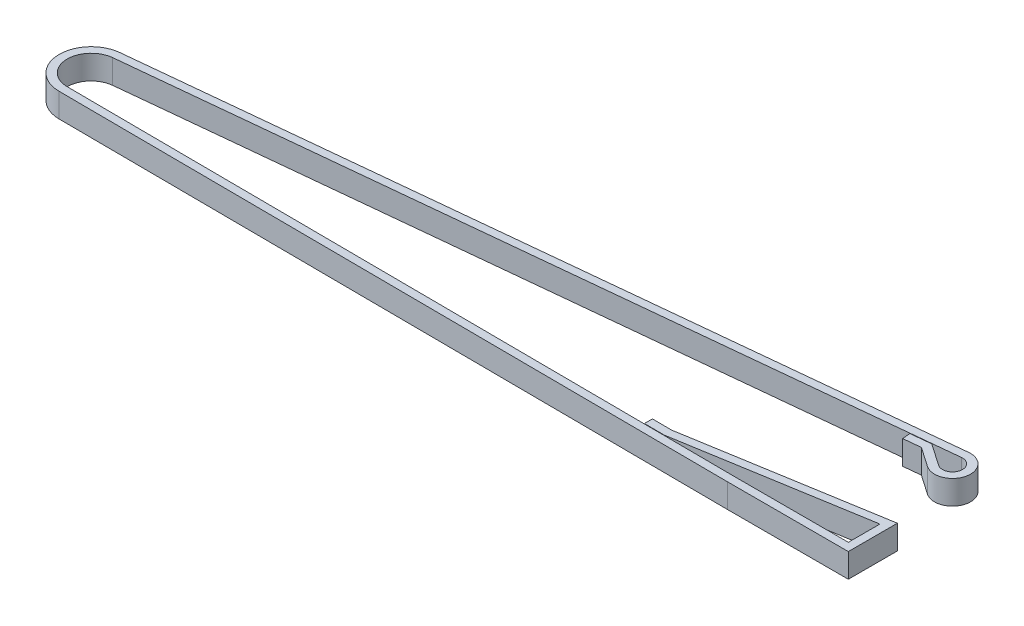
ISO-10303-21;
HEADER;
FILE_DESCRIPTION(('STEP AP214'),'2;1');
FILE_NAME('part.step','',(''),(''),'','','');
FILE_SCHEMA(('AUTOMOTIVE_DESIGN { 1 0 10303 214 1 1 1 1 }'));
ENDSEC;
DATA;
#1=APPLICATION_CONTEXT('core data for automotive mechanical design processes');
#2=APPLICATION_PROTOCOL_DEFINITION('international standard','automotive_design',2000,#1);
#3=PRODUCT_CONTEXT('',#1,'mechanical');
#4=PRODUCT('Part','Part','',(#3));
#5=PRODUCT_RELATED_PRODUCT_CATEGORY('part','',(#4));
#6=PRODUCT_DEFINITION_FORMATION('','',#4);
#7=PRODUCT_DEFINITION_CONTEXT('part definition',#1,'design');
#8=PRODUCT_DEFINITION('design','',#6,#7);
#9=PRODUCT_DEFINITION_SHAPE('','',#8);
#10=(LENGTH_UNIT() NAMED_UNIT(*) SI_UNIT(.MILLI.,.METRE.));
#11=(NAMED_UNIT(*) PLANE_ANGLE_UNIT() SI_UNIT($,.RADIAN.));
#12=(NAMED_UNIT(*) SI_UNIT($,.STERADIAN.) SOLID_ANGLE_UNIT());
#13=UNCERTAINTY_MEASURE_WITH_UNIT(LENGTH_MEASURE(1.E-05),#10,'distance_accuracy_value','');
#14=(GEOMETRIC_REPRESENTATION_CONTEXT(3) GLOBAL_UNCERTAINTY_ASSIGNED_CONTEXT((#13)) GLOBAL_UNIT_ASSIGNED_CONTEXT((#10,
#11,#12)) REPRESENTATION_CONTEXT('',''));
#15=CARTESIAN_POINT('',(0.,0.,0.));
#16=DIRECTION('',(0.,0.,1.));
#17=DIRECTION('',(1.,0.,0.));
#18=AXIS2_PLACEMENT_3D('',#15,#16,#17);
#19=CARTESIAN_POINT('',(53.8288651101957,52.4000000000005,-20.206925376891));
#20=DIRECTION('',(-0.00595588484105586,0.,0.999982263560589));
#21=DIRECTION('',(0.99998226356059,0.,0.00595588484105587));
#22=AXIS2_PLACEMENT_3D('',#19,#20,#21);
#23=PLANE('',#22);
#24=DIRECTION('',(-0.99998226356059,0.,-0.00595588484105587));
#25=VECTOR('',#24,1.);
#26=CARTESIAN_POINT('',(53.8288651101957,46.4000000000005,-20.206925376891));
#27=LINE('',#26,#25);
#28=CARTESIAN_POINT('',(53.6573448797996,46.4000000000005,-20.2079469497502));
#29=VERTEX_POINT('',#28);
#30=CARTESIAN_POINT('',(48.8288651101958,46.4000000000005,-20.2367053292866));
#31=VERTEX_POINT('',#30);
#32=EDGE_CURVE('E215',#29,#31,#27,.T.);
#33=ORIENTED_EDGE('',*,*,#32,.T.);
#34=DIRECTION('',(0.,-1.,0.));
#35=VECTOR('',#34,1.);
#36=CARTESIAN_POINT('',(48.8288651101958,52.4000000000005,-20.2367053292866));
#37=LINE('',#36,#35);
#38=CARTESIAN_POINT('',(48.8288651101958,52.4000000000005,-20.2367053292866));
#39=VERTEX_POINT('',#38);
#40=EDGE_CURVE('E11',#39,#31,#37,.T.);
#41=ORIENTED_EDGE('',*,*,#40,.F.);
#42=DIRECTION('',(-0.99998226356059,0.,-0.00595588484105587));
#43=VECTOR('',#42,1.);
#44=CARTESIAN_POINT('',(53.8288651101957,52.4000000000005,-20.206925376891));
#45=LINE('',#44,#43);
#46=CARTESIAN_POINT('',(53.6573448797996,52.4000000000005,-20.2079469497502));
#47=VERTEX_POINT('',#46);
#48=EDGE_CURVE('E134',#47,#39,#45,.T.);
#49=ORIENTED_EDGE('',*,*,#48,.F.);
#50=DIRECTION('',(0.,-1.,0.));
#51=VECTOR('',#50,1.);
#52=CARTESIAN_POINT('',(53.6573448797996,52.4000000000005,-20.2079469497502));
#53=LINE('',#52,#51);
#54=EDGE_CURVE('E211',#47,#29,#53,.T.);
#55=ORIENTED_EDGE('',*,*,#54,.T.);
#56=EDGE_LOOP('',(#33,#41,#49,#55));
#57=FACE_BOUND('',#56,.T.);
#58=ADVANCED_FACE('F36',(#57),#23,.F.);
#59=CARTESIAN_POINT('',(48.8169533405136,52.4000000000005,-18.2367408021654));
#60=DIRECTION('',(-0.999982263560589,0.,-0.00595588484105652));
#61=DIRECTION('',(-0.00595588484105652,0.,0.999982263560589));
#62=AXIS2_PLACEMENT_3D('',#59,#60,#61);
#63=PLANE('',#62);
#64=DIRECTION('',(0.00595588484105652,0.,-0.999982263560589));
#65=VECTOR('',#64,1.);
#66=CARTESIAN_POINT('',(48.8169533405136,46.4000000000005,-18.2367408021654));
#67=LINE('',#66,#65);
#68=CARTESIAN_POINT('',(48.8169533405136,46.4000000000005,-18.2367408021654));
#69=VERTEX_POINT('',#68);
#70=EDGE_CURVE('E218',#69,#31,#67,.T.);
#71=ORIENTED_EDGE('',*,*,#70,.F.);
#72=DIRECTION('',(0.,-1.,0.));
#73=VECTOR('',#72,1.);
#74=CARTESIAN_POINT('',(48.8169533405136,52.4000000000005,-18.2367408021654));
#75=LINE('',#74,#73);
#76=CARTESIAN_POINT('',(48.8169533405136,52.4000000000005,-18.2367408021654));
#77=VERTEX_POINT('',#76);
#78=EDGE_CURVE('E44',#77,#69,#75,.T.);
#79=ORIENTED_EDGE('',*,*,#78,.F.);
#80=DIRECTION('',(0.00595588484105652,0.,-0.999982263560589));
#81=VECTOR('',#80,1.);
#82=CARTESIAN_POINT('',(48.8169533405136,52.4000000000005,-18.2367408021654));
#83=LINE('',#82,#81);
#84=EDGE_CURVE('E330',#77,#39,#83,.T.);
#85=ORIENTED_EDGE('',*,*,#84,.T.);
#86=ORIENTED_EDGE('',*,*,#40,.T.);
#87=EDGE_LOOP('',(#71,#79,#85,#86));
#88=FACE_BOUND('',#87,.T.);
#89=ADVANCED_FACE('F317',(#88),#63,.T.);
#90=CARTESIAN_POINT('',(53.8169533405136,52.4000000000005,-18.2069608497698));
#91=DIRECTION('',(-0.00595588484105586,0.,0.999982263560589));
#92=DIRECTION('',(0.999982263560589,0.,0.00595588484105586));
#93=AXIS2_PLACEMENT_3D('',#90,#91,#92);
#94=PLANE('',#93);
#95=DIRECTION('',(-0.999982263560589,0.,-0.00595588484105586));
#96=VECTOR('',#95,1.);
#97=CARTESIAN_POINT('',(53.8169533405136,46.4000000000005,-18.2069608497698));
#98=LINE('',#97,#96);
#99=CARTESIAN_POINT('',(53.8169533405136,46.4000000000005,-18.2069608497698));
#100=VERTEX_POINT('',#99);
#101=EDGE_CURVE('E221',#100,#69,#98,.T.);
#102=ORIENTED_EDGE('',*,*,#101,.F.);
#103=DIRECTION('',(0.,-1.,0.));
#104=VECTOR('',#103,1.);
#105=CARTESIAN_POINT('',(53.8169533405136,52.4000000000005,-18.2069608497698));
#106=LINE('',#105,#104);
#107=CARTESIAN_POINT('',(53.8169533405136,52.4000000000005,-18.2069608497698));
#108=VERTEX_POINT('',#107);
#109=EDGE_CURVE('E307',#108,#100,#106,.T.);
#110=ORIENTED_EDGE('',*,*,#109,.F.);
#111=DIRECTION('',(-0.999982263560589,0.,-0.00595588484105586));
#112=VECTOR('',#111,1.);
#113=CARTESIAN_POINT('',(53.8169533405136,52.4000000000005,-18.2069608497698));
#114=LINE('',#113,#112);
#115=EDGE_CURVE('E314',#108,#77,#114,.T.);
#116=ORIENTED_EDGE('',*,*,#115,.T.);
#117=ORIENTED_EDGE('',*,*,#78,.T.);
#118=EDGE_LOOP('',(#102,#110,#116,#117));
#119=FACE_BOUND('',#118,.T.);
#120=ADVANCED_FACE('F312',(#119),#94,.T.);
#121=CARTESIAN_POINT('',(99.9751882418946,52.4000000000005,-25.9));
#122=DIRECTION('',(0.164398987305357,0.,0.986393923832144));
#123=DIRECTION('',(0.986393923832144,0.,-0.164398987305357));
#124=AXIS2_PLACEMENT_3D('',#121,#122,#123);
#125=PLANE('',#124);
#126=DIRECTION('',(-0.986393923832144,0.,0.164398987305357));
#127=VECTOR('',#126,1.);
#128=CARTESIAN_POINT('',(99.9751882418946,46.4000000000005,-25.9));
#129=LINE('',#128,#127);
#130=CARTESIAN_POINT('',(99.9751882418946,46.4000000000005,-25.9));
#131=VERTEX_POINT('',#130);
#132=EDGE_CURVE('E224',#131,#100,#129,.T.);
#133=ORIENTED_EDGE('',*,*,#132,.F.);
#134=DIRECTION('',(0.,-1.,0.));
#135=VECTOR('',#134,1.);
#136=CARTESIAN_POINT('',(99.9751882418946,52.4000000000005,-25.9));
#137=LINE('',#136,#135);
#138=CARTESIAN_POINT('',(99.9751882418946,52.4000000000005,-25.9));
#139=VERTEX_POINT('',#138);
#140=EDGE_CURVE('E305',#139,#131,#137,.T.);
#141=ORIENTED_EDGE('',*,*,#140,.F.);
#142=DIRECTION('',(-0.986393923832144,0.,0.164398987305357));
#143=VECTOR('',#142,1.);
#144=CARTESIAN_POINT('',(99.9751882418946,52.4000000000005,-25.9));
#145=LINE('',#144,#143);
#146=EDGE_CURVE('E327',#139,#108,#145,.T.);
#147=ORIENTED_EDGE('',*,*,#146,.T.);
#148=ORIENTED_EDGE('',*,*,#109,.T.);
#149=EDGE_LOOP('',(#133,#141,#147,#148));
#150=FACE_BOUND('',#149,.T.);
#151=ADVANCED_FACE('F324',(#150),#125,.T.);
#152=CARTESIAN_POINT('',(99.9751882418946,52.4000000000005,-18.));
#153=DIRECTION('',(-1.,0.,0.));
#154=DIRECTION('',(0.,-1.,0.));
#155=AXIS2_PLACEMENT_3D('',#152,#153,#154);
#156=PLANE('',#155);
#157=DIRECTION('',(0.,0.,-1.));
#158=VECTOR('',#157,1.);
#159=CARTESIAN_POINT('',(99.9751882418946,46.4000000000005,-18.));
#160=LINE('',#159,#158);
#161=CARTESIAN_POINT('',(99.9751882418946,46.4000000000005,-18.));
#162=VERTEX_POINT('',#161);
#163=EDGE_CURVE('E227',#162,#131,#160,.T.);
#164=ORIENTED_EDGE('',*,*,#163,.F.);
#165=DIRECTION('',(0.,-1.,0.));
#166=VECTOR('',#165,1.);
#167=CARTESIAN_POINT('',(99.9751882418946,52.4000000000005,-18.));
#168=LINE('',#167,#166);
#169=CARTESIAN_POINT('',(99.9751882418946,52.4000000000005,-18.));
#170=VERTEX_POINT('',#169);
#171=EDGE_CURVE('E303',#170,#162,#168,.T.);
#172=ORIENTED_EDGE('',*,*,#171,.F.);
#173=DIRECTION('',(0.,0.,-1.));
#174=VECTOR('',#173,1.);
#175=CARTESIAN_POINT('',(99.9751882418946,52.4000000000005,-18.));
#176=LINE('',#175,#174);
#177=EDGE_CURVE('E332',#170,#139,#176,.T.);
#178=ORIENTED_EDGE('',*,*,#177,.T.);
#179=ORIENTED_EDGE('',*,*,#140,.T.);
#180=EDGE_LOOP('',(#164,#172,#178,#179));
#181=FACE_BOUND('',#180,.T.);
#182=ADVANCED_FACE('F403',(#181),#156,.T.);
#183=CARTESIAN_POINT('',(71.7751882418946,52.4000000000005,-18.));
#184=DIRECTION('',(0.,0.,-1.));
#185=DIRECTION('',(0.,1.,0.));
#186=AXIS2_PLACEMENT_3D('',#183,#184,#185);
#187=PLANE('',#186);
#188=DIRECTION('',(1.,0.,0.));
#189=VECTOR('',#188,1.);
#190=CARTESIAN_POINT('',(71.7751882418946,46.4000000000005,-18.));
#191=LINE('',#190,#189);
#192=CARTESIAN_POINT('',(71.7751882418946,46.4000000000005,-18.));
#193=VERTEX_POINT('',#192);
#194=EDGE_CURVE('E230',#193,#162,#191,.T.);
#195=ORIENTED_EDGE('',*,*,#194,.F.);
#196=DIRECTION('',(0.,-1.,0.));
#197=VECTOR('',#196,1.);
#198=CARTESIAN_POINT('',(71.7751882418946,52.4000000000005,-18.));
#199=LINE('',#198,#197);
#200=CARTESIAN_POINT('',(71.7751882418946,52.4000000000005,-18.));
#201=VERTEX_POINT('',#200);
#202=EDGE_CURVE('E301',#201,#193,#199,.T.);
#203=ORIENTED_EDGE('',*,*,#202,.F.);
#204=DIRECTION('',(1.,0.,0.));
#205=VECTOR('',#204,1.);
#206=CARTESIAN_POINT('',(71.7751882418946,52.4000000000005,-18.));
#207=LINE('',#206,#205);
#208=EDGE_CURVE('E338',#201,#170,#207,.T.);
#209=ORIENTED_EDGE('',*,*,#208,.T.);
#210=ORIENTED_EDGE('',*,*,#171,.T.);
#211=EDGE_LOOP('',(#195,#203,#209,#210));
#212=FACE_BOUND('',#211,.T.);
#213=ADVANCED_FACE('F406',(#212),#187,.T.);
#214=CARTESIAN_POINT('',(-96.1408657111832,52.4000000000005,-19.0001064186359));
#215=DIRECTION('',(0.00595588484105567,0.,-0.999982263560589));
#216=DIRECTION('',(-0.999982263560589,0.,-0.00595588484105567));
#217=AXIS2_PLACEMENT_3D('',#214,#215,#216);
#218=PLANE('',#217);
#219=DIRECTION('',(0.999982263560589,0.,0.00595588484105568));
#220=VECTOR('',#219,1.);
#221=CARTESIAN_POINT('',(-96.1408657111832,46.4000000000005,-19.0001064186359));
#222=LINE('',#221,#220);
#223=CARTESIAN_POINT('',(-96.1408657111832,46.4000000000005,-19.0001064186359));
#224=VERTEX_POINT('',#223);
#225=EDGE_CURVE('E233',#224,#193,#222,.T.);
#226=ORIENTED_EDGE('',*,*,#225,.F.);
#227=DIRECTION('',(0.,-1.,0.));
#228=VECTOR('',#227,1.);
#229=CARTESIAN_POINT('',(-96.1408657111832,52.4000000000005,-19.0001064186359));
#230=LINE('',#229,#228);
#231=CARTESIAN_POINT('',(-96.1408657111832,52.4000000000005,-19.0001064186359));
#232=VERTEX_POINT('',#231);
#233=EDGE_CURVE('E299',#232,#224,#230,.T.);
#234=ORIENTED_EDGE('',*,*,#233,.F.);
#235=DIRECTION('',(0.999982263560589,0.,0.00595588484105568));
#236=VECTOR('',#235,1.);
#237=CARTESIAN_POINT('',(-96.1408657111832,52.4000000000005,-19.0001064186359));
#238=LINE('',#237,#236);
#239=EDGE_CURVE('E341',#232,#201,#238,.T.);
#240=ORIENTED_EDGE('',*,*,#239,.T.);
#241=ORIENTED_EDGE('',*,*,#202,.T.);
#242=EDGE_LOOP('',(#226,#234,#240,#241));
#243=FACE_BOUND('',#242,.T.);
#244=ADVANCED_FACE('F410',(#243),#218,.T.);
#245=CARTESIAN_POINT('',(-96.1051304021369,52.4000000000005,-24.9999999999995));
#246=DIRECTION('',(0.,-1.,0.));
#247=DIRECTION('',(1.,0.,0.));
#248=AXIS2_PLACEMENT_3D('',#245,#246,#247);
#249=CYLINDRICAL_SURFACE('',#248,6.00000000000002);
#250=CARTESIAN_POINT('',(-96.1051304021369,46.4000000000005,-24.9999999999995));
#251=DIRECTION('',(0.,1.,0.));
#252=DIRECTION('',(-1.,0.,0.));
#253=AXIS2_PLACEMENT_3D('',#250,#251,#252);
#254=CIRCLE('',#253,6.00000000000002);
#255=CARTESIAN_POINT('',(-96.7105061324668,46.4000000000005,-30.9693818964045));
#256=VERTEX_POINT('',#255);
#257=EDGE_CURVE('E236',#256,#224,#254,.T.);
#258=ORIENTED_EDGE('',*,*,#257,.F.);
#259=DIRECTION('',(0.,-1.,0.));
#260=VECTOR('',#259,1.);
#261=CARTESIAN_POINT('',(-96.7105061324668,52.4000000000005,-30.9693818964045));
#262=LINE('',#261,#260);
#263=CARTESIAN_POINT('',(-96.7105061324668,52.4000000000005,-30.9693818964045));
#264=VERTEX_POINT('',#263);
#265=EDGE_CURVE('E297',#264,#256,#262,.T.);
#266=ORIENTED_EDGE('',*,*,#265,.F.);
#267=CARTESIAN_POINT('',(-96.1051304021369,52.4000000000005,-24.9999999999995));
#268=DIRECTION('',(0.,1.,0.));
#269=DIRECTION('',(-1.,0.,0.));
#270=AXIS2_PLACEMENT_3D('',#267,#268,#269);
#271=CIRCLE('',#270,6.00000000000002);
#272=EDGE_CURVE('E344',#264,#232,#271,.T.);
#273=ORIENTED_EDGE('',*,*,#272,.T.);
#274=ORIENTED_EDGE('',*,*,#233,.T.);
#275=EDGE_LOOP('',(#258,#266,#273,#274));
#276=FACE_BOUND('',#275,.T.);
#277=ADVANCED_FACE('F414',(#276),#249,.F.);
#278=CARTESIAN_POINT('',(95.7477601123625,52.4000000000005,-50.4872424568354));
#279=DIRECTION('',(0.100895955054986,0.,0.994896982734163));
#280=DIRECTION('',(0.994896982734163,0.,-0.100895955054986));
#281=AXIS2_PLACEMENT_3D('',#278,#279,#280);
#282=PLANE('',#281);
#283=DIRECTION('',(-0.994896982734163,0.,0.100895955054986));
#284=VECTOR('',#283,1.);
#285=CARTESIAN_POINT('',(95.7477601123625,46.4000000000005,-50.4872424568354));
#286=LINE('',#285,#284);
#287=CARTESIAN_POINT('',(95.7477601123625,46.4000000000005,-50.4872424568354));
#288=VERTEX_POINT('',#287);
#289=EDGE_CURVE('E239',#288,#256,#286,.T.);
#290=ORIENTED_EDGE('',*,*,#289,.F.);
#291=DIRECTION('',(0.,-1.,0.));
#292=VECTOR('',#291,1.);
#293=CARTESIAN_POINT('',(95.7477601123625,52.4000000000005,-50.4872424568354));
#294=LINE('',#293,#292);
#295=CARTESIAN_POINT('',(95.7477601123625,52.4000000000005,-50.4872424568354));
#296=VERTEX_POINT('',#295);
#297=EDGE_CURVE('E295',#296,#288,#294,.T.);
#298=ORIENTED_EDGE('',*,*,#297,.F.);
#299=DIRECTION('',(-0.994896982734163,0.,0.100895955054986));
#300=VECTOR('',#299,1.);
#301=CARTESIAN_POINT('',(95.7477601123625,52.4000000000005,-50.4872424568354));
#302=LINE('',#301,#300);
#303=EDGE_CURVE('E347',#296,#264,#302,.T.);
#304=ORIENTED_EDGE('',*,*,#303,.T.);
#305=ORIENTED_EDGE('',*,*,#265,.T.);
#306=EDGE_LOOP('',(#290,#298,#304,#305));
#307=FACE_BOUND('',#306,.T.);
#308=ADVANCED_FACE('F418',(#307),#282,.T.);
#309=CARTESIAN_POINT('',(95.9999999999999,52.4000000000005,-48.));
#310=DIRECTION('',(0.,-1.,0.));
#311=DIRECTION('',(1.,0.,0.));
#312=AXIS2_PLACEMENT_3D('',#309,#310,#311);
#313=CYLINDRICAL_SURFACE('',#312,2.50000000000001);
#314=CARTESIAN_POINT('',(95.9999999999999,46.4000000000005,-48.));
#315=DIRECTION('',(0.,1.,0.));
#316=DIRECTION('',(1.,0.,0.));
#317=AXIS2_PLACEMENT_3D('',#314,#315,#316);
#318=CIRCLE('',#317,2.50000000000001);
#319=CARTESIAN_POINT('',(94.5811412516911,46.4000000000005,-45.9416414665206));
#320=VERTEX_POINT('',#319);
#321=EDGE_CURVE('E242',#320,#288,#318,.T.);
#322=ORIENTED_EDGE('',*,*,#321,.F.);
#323=DIRECTION('',(0.,-1.,0.));
#324=VECTOR('',#323,1.);
#325=CARTESIAN_POINT('',(94.5811412516911,52.4000000000005,-45.9416414665206));
#326=LINE('',#325,#324);
#327=CARTESIAN_POINT('',(94.5811412516911,52.4000000000005,-45.9416414665206));
#328=VERTEX_POINT('',#327);
#329=EDGE_CURVE('E293',#328,#320,#326,.T.);
#330=ORIENTED_EDGE('',*,*,#329,.F.);
#331=CARTESIAN_POINT('',(95.9999999999999,52.4000000000005,-48.));
#332=DIRECTION('',(0.,1.,0.));
#333=DIRECTION('',(1.,0.,0.));
#334=AXIS2_PLACEMENT_3D('',#331,#332,#333);
#335=CIRCLE('',#334,2.50000000000001);
#336=EDGE_CURVE('E350',#328,#296,#335,.T.);
#337=ORIENTED_EDGE('',*,*,#336,.T.);
#338=ORIENTED_EDGE('',*,*,#297,.T.);
#339=EDGE_LOOP('',(#322,#330,#337,#338));
#340=FACE_BOUND('',#339,.T.);
#341=ADVANCED_FACE('F422',(#340),#313,.F.);
#342=CARTESIAN_POINT('',(94.5811412516911,52.4000000000005,-45.9416414665206));
#343=DIRECTION('',(0.567543499323527,0.,-0.823343413391767));
#344=DIRECTION('',(-0.823343413391767,0.,-0.567543499323527));
#345=AXIS2_PLACEMENT_3D('',#342,#343,#344);
#346=PLANE('',#345);
#347=DIRECTION('',(0.823343413391767,0.,0.567543499323527));
#348=VECTOR('',#347,1.);
#349=CARTESIAN_POINT('',(94.5811412516911,46.4000000000005,-45.9416414665206));
#350=LINE('',#349,#348);
#351=CARTESIAN_POINT('',(89.1092582739929,46.4000000000005,-49.7134960323553));
#352=VERTEX_POINT('',#351);
#353=EDGE_CURVE('E245',#352,#320,#350,.T.);
#354=ORIENTED_EDGE('',*,*,#353,.F.);
#355=DIRECTION('',(0.,-1.,0.));
#356=VECTOR('',#355,1.);
#357=CARTESIAN_POINT('',(89.1092582739929,52.4000000000005,-49.7134960323553));
#358=LINE('',#357,#356);
#359=CARTESIAN_POINT('',(89.1092582739929,52.4000000000005,-49.7134960323553));
#360=VERTEX_POINT('',#359);
#361=EDGE_CURVE('E291',#360,#352,#358,.T.);
#362=ORIENTED_EDGE('',*,*,#361,.F.);
#363=DIRECTION('',(0.823343413391767,0.,0.567543499323527));
#364=VECTOR('',#363,1.);
#365=CARTESIAN_POINT('',(94.5811412516911,52.4000000000005,-45.9416414665206));
#366=LINE('',#365,#364);
#367=EDGE_CURVE('E353',#360,#328,#366,.T.);
#368=ORIENTED_EDGE('',*,*,#367,.T.);
#369=ORIENTED_EDGE('',*,*,#329,.T.);
#370=EDGE_LOOP('',(#354,#362,#368,#369));
#371=FACE_BOUND('',#370,.T.);
#372=ADVANCED_FACE('F426',(#371),#346,.T.);
#373=CARTESIAN_POINT('',(89.1092582739929,52.4000000000005,-49.7134960323553));
#374=DIRECTION('',(-0.100895955054986,0.,-0.994896982734163));
#375=DIRECTION('',(-0.994896982734164,0.,0.100895955054986));
#376=AXIS2_PLACEMENT_3D('',#373,#374,#375);
#377=PLANE('',#376);
#378=DIRECTION('',(0.994896982734163,0.,-0.100895955054986));
#379=VECTOR('',#378,1.);
#380=CARTESIAN_POINT('',(89.1092582739929,46.4000000000005,-49.7134960323553));
#381=LINE('',#380,#379);
#382=CARTESIAN_POINT('',(84.1347733603221,46.4000000000005,-49.2090162570804));
#383=VERTEX_POINT('',#382);
#384=EDGE_CURVE('E248',#383,#352,#381,.T.);
#385=ORIENTED_EDGE('',*,*,#384,.F.);
#386=DIRECTION('',(0.,-1.,0.));
#387=VECTOR('',#386,1.);
#388=CARTESIAN_POINT('',(84.1347733603221,52.4000000000005,-49.2090162570804));
#389=LINE('',#388,#387);
#390=CARTESIAN_POINT('',(84.1347733603221,52.4000000000005,-49.2090162570804));
#391=VERTEX_POINT('',#390);
#392=EDGE_CURVE('E289',#391,#383,#389,.T.);
#393=ORIENTED_EDGE('',*,*,#392,.F.);
#394=DIRECTION('',(0.994896982734163,0.,-0.100895955054986));
#395=VECTOR('',#394,1.);
#396=CARTESIAN_POINT('',(89.1092582739929,52.4000000000005,-49.7134960323553));
#397=LINE('',#396,#395);
#398=EDGE_CURVE('E356',#391,#360,#397,.T.);
#399=ORIENTED_EDGE('',*,*,#398,.T.);
#400=ORIENTED_EDGE('',*,*,#361,.T.);
#401=EDGE_LOOP('',(#385,#393,#399,#400));
#402=FACE_BOUND('',#401,.T.);
#403=ADVANCED_FACE('F430',(#402),#377,.T.);
#404=CARTESIAN_POINT('',(84.336565270432,52.4000000000005,-47.2192222916121));
#405=DIRECTION('',(-0.994896982734163,0.,0.100895955054983));
#406=DIRECTION('',(0.100895955054983,0.,0.994896982734164));
#407=AXIS2_PLACEMENT_3D('',#404,#405,#406);
#408=PLANE('',#407);
#409=DIRECTION('',(-0.100895955054983,0.,-0.994896982734164));
#410=VECTOR('',#409,1.);
#411=CARTESIAN_POINT('',(84.336565270432,46.4000000000005,-47.2192222916121));
#412=LINE('',#411,#410);
#413=CARTESIAN_POINT('',(84.336565270432,46.4000000000005,-47.2192222916121));
#414=VERTEX_POINT('',#413);
#415=EDGE_CURVE('E251',#414,#383,#412,.T.);
#416=ORIENTED_EDGE('',*,*,#415,.F.);
#417=DIRECTION('',(0.,-1.,0.));
#418=VECTOR('',#417,1.);
#419=CARTESIAN_POINT('',(84.336565270432,52.4000000000005,-47.2192222916121));
#420=LINE('',#419,#418);
#421=CARTESIAN_POINT('',(84.336565270432,52.4000000000005,-47.2192222916121));
#422=VERTEX_POINT('',#421);
#423=EDGE_CURVE('E287',#422,#414,#420,.T.);
#424=ORIENTED_EDGE('',*,*,#423,.F.);
#425=DIRECTION('',(-0.100895955054983,0.,-0.994896982734164));
#426=VECTOR('',#425,1.);
#427=CARTESIAN_POINT('',(84.336565270432,52.4000000000005,-47.2192222916121));
#428=LINE('',#427,#426);
#429=EDGE_CURVE('E359',#422,#391,#428,.T.);
#430=ORIENTED_EDGE('',*,*,#429,.T.);
#431=ORIENTED_EDGE('',*,*,#392,.T.);
#432=EDGE_LOOP('',(#416,#424,#430,#431));
#433=FACE_BOUND('',#432,.T.);
#434=ADVANCED_FACE('F434',(#433),#408,.T.);
#435=CARTESIAN_POINT('',(89.3110501841029,52.4000000000005,-47.723702066887));
#436=DIRECTION('',(-0.100895955054986,0.,-0.994896982734163));
#437=DIRECTION('',(-0.994896982734164,0.,0.100895955054986));
#438=AXIS2_PLACEMENT_3D('',#435,#436,#437);
#439=PLANE('',#438);
#440=DIRECTION('',(0.994896982734163,0.,-0.100895955054986));
#441=VECTOR('',#440,1.);
#442=CARTESIAN_POINT('',(89.3110501841029,46.4000000000005,-47.723702066887));
#443=LINE('',#442,#441);
#444=CARTESIAN_POINT('',(88.5795425157895,46.4000000000005,-47.6495173361004));
#445=VERTEX_POINT('',#444);
#446=EDGE_CURVE('E254',#414,#445,#443,.T.);
#447=ORIENTED_EDGE('',*,*,#446,.T.);
#448=DIRECTION('',(0.,-1.,0.));
#449=VECTOR('',#448,1.);
#450=CARTESIAN_POINT('',(88.5795425157895,52.4000000000005,-47.6495173361004));
#451=LINE('',#450,#449);
#452=CARTESIAN_POINT('',(88.5795425157895,52.4000000000005,-47.6495173361004));
#453=VERTEX_POINT('',#452);
#454=EDGE_CURVE('E284',#453,#445,#451,.T.);
#455=ORIENTED_EDGE('',*,*,#454,.F.);
#456=DIRECTION('',(0.994896982734163,0.,-0.100895955054986));
#457=VECTOR('',#456,1.);
#458=CARTESIAN_POINT('',(89.3110501841029,52.4000000000005,-47.723702066887));
#459=LINE('',#458,#457);
#460=EDGE_CURVE('E362',#422,#453,#459,.T.);
#461=ORIENTED_EDGE('',*,*,#460,.F.);
#462=ORIENTED_EDGE('',*,*,#423,.T.);
#463=EDGE_LOOP('',(#447,#455,#461,#462));
#464=FACE_BOUND('',#463,.T.);
#465=ADVANCED_FACE('F438',(#464),#439,.F.);
#466=CARTESIAN_POINT('',(93.4460542530441,52.4000000000005,-44.294954639737));
#467=DIRECTION('',(0.567543499323527,0.,-0.823343413391767));
#468=DIRECTION('',(-0.823343413391767,0.,-0.567543499323527));
#469=AXIS2_PLACEMENT_3D('',#466,#467,#468);
#470=PLANE('',#469);
#471=DIRECTION('',(0.823343413391767,0.,0.567543499323527));
#472=VECTOR('',#471,1.);
#473=CARTESIAN_POINT('',(93.4460542530441,46.4000000000005,-44.294954639737));
#474=LINE('',#473,#472);
#475=CARTESIAN_POINT('',(93.4460542530441,46.4000000000005,-44.2949546397371));
#476=VERTEX_POINT('',#475);
#477=EDGE_CURVE('E256',#445,#476,#474,.T.);
#478=ORIENTED_EDGE('',*,*,#477,.T.);
#479=DIRECTION('',(0.,-1.,0.));
#480=VECTOR('',#479,1.);
#481=CARTESIAN_POINT('',(93.4460542530441,52.4000000000005,-44.2949546397371));
#482=LINE('',#481,#480);
#483=CARTESIAN_POINT('',(93.4460542530441,52.4000000000005,-44.2949546397371));
#484=VERTEX_POINT('',#483);
#485=EDGE_CURVE('E281',#484,#476,#482,.T.);
#486=ORIENTED_EDGE('',*,*,#485,.F.);
#487=DIRECTION('',(0.823343413391767,0.,0.567543499323527));
#488=VECTOR('',#487,1.);
#489=CARTESIAN_POINT('',(93.4460542530441,52.4000000000005,-44.294954639737));
#490=LINE('',#489,#488);
#491=EDGE_CURVE('E364',#453,#484,#490,.T.);
#492=ORIENTED_EDGE('',*,*,#491,.F.);
#493=ORIENTED_EDGE('',*,*,#454,.T.);
#494=EDGE_LOOP('',(#478,#486,#492,#493));
#495=FACE_BOUND('',#494,.T.);
#496=ADVANCED_FACE('F442',(#495),#470,.F.);
#497=CARTESIAN_POINT('',(95.9999999999999,52.4000000000005,-48.));
#498=DIRECTION('',(0.,-1.,0.));
#499=DIRECTION('',(1.,0.,0.));
#500=AXIS2_PLACEMENT_3D('',#497,#498,#499);
#501=CYLINDRICAL_SURFACE('',#500,4.50000000000001);
#502=CARTESIAN_POINT('',(95.9999999999999,46.4000000000005,-48.));
#503=DIRECTION('',(0.,1.,0.));
#504=DIRECTION('',(1.,0.,0.));
#505=AXIS2_PLACEMENT_3D('',#502,#503,#504);
#506=CIRCLE('',#505,4.50000000000001);
#507=CARTESIAN_POINT('',(95.5459682022525,46.4000000000005,-52.4770364223037));
#508=VERTEX_POINT('',#507);
#509=EDGE_CURVE('E258',#476,#508,#506,.T.);
#510=ORIENTED_EDGE('',*,*,#509,.T.);
#511=DIRECTION('',(0.,-1.,0.));
#512=VECTOR('',#511,1.);
#513=CARTESIAN_POINT('',(95.5459682022525,52.4000000000005,-52.4770364223037));
#514=LINE('',#513,#512);
#515=CARTESIAN_POINT('',(95.5459682022525,52.4000000000005,-52.4770364223037));
#516=VERTEX_POINT('',#515);
#517=EDGE_CURVE('E278',#516,#508,#514,.T.);
#518=ORIENTED_EDGE('',*,*,#517,.F.);
#519=CARTESIAN_POINT('',(95.9999999999999,52.4000000000005,-48.));
#520=DIRECTION('',(0.,1.,0.));
#521=DIRECTION('',(1.,0.,0.));
#522=AXIS2_PLACEMENT_3D('',#519,#520,#521);
#523=CIRCLE('',#522,4.50000000000001);
#524=EDGE_CURVE('E366',#484,#516,#523,.T.);
#525=ORIENTED_EDGE('',*,*,#524,.F.);
#526=ORIENTED_EDGE('',*,*,#485,.T.);
#527=EDGE_LOOP('',(#510,#518,#525,#526));
#528=FACE_BOUND('',#527,.T.);
#529=ADVANCED_FACE('F446',(#528),#501,.T.);
#530=CARTESIAN_POINT('',(95.5459682022525,52.4000000000005,-52.4770364223037));
#531=DIRECTION('',(0.100895955054986,0.,0.994896982734163));
#532=DIRECTION('',(0.994896982734163,0.,-0.100895955054986));
#533=AXIS2_PLACEMENT_3D('',#530,#531,#532);
#534=PLANE('',#533);
#535=DIRECTION('',(-0.994896982734163,0.,0.100895955054986));
#536=VECTOR('',#535,1.);
#537=CARTESIAN_POINT('',(95.5459682022525,46.4000000000005,-52.4770364223037));
#538=LINE('',#537,#536);
#539=CARTESIAN_POINT('',(-96.9122980425768,46.4000000000005,-32.9591758618728));
#540=VERTEX_POINT('',#539);
#541=EDGE_CURVE('E260',#508,#540,#538,.T.);
#542=ORIENTED_EDGE('',*,*,#541,.T.);
#543=DIRECTION('',(0.,-1.,0.));
#544=VECTOR('',#543,1.);
#545=CARTESIAN_POINT('',(-96.9122980425768,52.4000000000005,-32.9591758618728));
#546=LINE('',#545,#544);
#547=CARTESIAN_POINT('',(-96.9122980425768,52.4000000000005,-32.9591758618728));
#548=VERTEX_POINT('',#547);
#549=EDGE_CURVE('E275',#548,#540,#546,.T.);
#550=ORIENTED_EDGE('',*,*,#549,.F.);
#551=DIRECTION('',(-0.994896982734163,0.,0.100895955054986));
#552=VECTOR('',#551,1.);
#553=CARTESIAN_POINT('',(95.5459682022525,52.4000000000005,-52.4770364223037));
#554=LINE('',#553,#552);
#555=EDGE_CURVE('E368',#516,#548,#554,.T.);
#556=ORIENTED_EDGE('',*,*,#555,.F.);
#557=ORIENTED_EDGE('',*,*,#517,.T.);
#558=EDGE_LOOP('',(#542,#550,#556,#557));
#559=FACE_BOUND('',#558,.T.);
#560=ADVANCED_FACE('F450',(#559),#534,.F.);
#561=CARTESIAN_POINT('',(-96.1051304021369,52.4000000000005,-24.9999999999995));
#562=DIRECTION('',(0.,-1.,0.));
#563=DIRECTION('',(1.,0.,0.));
#564=AXIS2_PLACEMENT_3D('',#561,#562,#563);
#565=CYLINDRICAL_SURFACE('',#564,8.00000000000002);
#566=CARTESIAN_POINT('',(-96.1051304021369,46.4000000000005,-24.9999999999995));
#567=DIRECTION('',(0.,1.,0.));
#568=DIRECTION('',(1.,0.,0.));
#569=AXIS2_PLACEMENT_3D('',#566,#567,#568);
#570=CIRCLE('',#569,8.00000000000002);
#571=CARTESIAN_POINT('',(-96.1527774808654,46.4000000000005,-17.0001418915147));
#572=VERTEX_POINT('',#571);
#573=EDGE_CURVE('E262',#540,#572,#570,.T.);
#574=ORIENTED_EDGE('',*,*,#573,.T.);
#575=DIRECTION('',(0.,-1.,0.));
#576=VECTOR('',#575,1.);
#577=CARTESIAN_POINT('',(-96.1527774808654,52.4000000000005,-17.0001418915147));
#578=LINE('',#577,#576);
#579=CARTESIAN_POINT('',(-96.1527774808654,52.4000000000005,-17.0001418915147));
#580=VERTEX_POINT('',#579);
#581=EDGE_CURVE('E272',#580,#572,#578,.T.);
#582=ORIENTED_EDGE('',*,*,#581,.F.);
#583=CARTESIAN_POINT('',(-96.1051304021369,52.4000000000005,-24.9999999999995));
#584=DIRECTION('',(0.,1.,0.));
#585=DIRECTION('',(1.,0.,0.));
#586=AXIS2_PLACEMENT_3D('',#583,#584,#585);
#587=CIRCLE('',#586,8.00000000000002);
#588=EDGE_CURVE('E370',#548,#580,#587,.T.);
#589=ORIENTED_EDGE('',*,*,#588,.F.);
#590=ORIENTED_EDGE('',*,*,#549,.T.);
#591=EDGE_LOOP('',(#574,#582,#589,#590));
#592=FACE_BOUND('',#591,.T.);
#593=ADVANCED_FACE('F376',(#592),#565,.T.);
#594=CARTESIAN_POINT('',(-96.1527774808654,52.4000000000005,-17.0001418915147));
#595=DIRECTION('',(0.00595588484105568,0.,-0.999982263560589));
#596=DIRECTION('',(-0.99998226356059,0.,-0.00595588484105568));
#597=AXIS2_PLACEMENT_3D('',#594,#595,#596);
#598=PLANE('',#597);
#599=DIRECTION('',(0.99998226356059,0.,0.00595588484105568));
#600=VECTOR('',#599,1.);
#601=CARTESIAN_POINT('',(-96.1527774808654,46.4000000000005,-17.0001418915147));
#602=LINE('',#601,#600);
#603=CARTESIAN_POINT('',(71.7692323042345,46.4000000000005,-16.));
#604=VERTEX_POINT('',#603);
#605=EDGE_CURVE('E264',#572,#604,#602,.T.);
#606=ORIENTED_EDGE('',*,*,#605,.T.);
#607=DIRECTION('',(0.,-1.,0.));
#608=VECTOR('',#607,1.);
#609=CARTESIAN_POINT('',(71.7692323042345,52.4000000000005,-16.));
#610=LINE('',#609,#608);
#611=CARTESIAN_POINT('',(71.7692323042345,52.4000000000005,-16.));
#612=VERTEX_POINT('',#611);
#613=EDGE_CURVE('E206',#612,#604,#610,.T.);
#614=ORIENTED_EDGE('',*,*,#613,.F.);
#615=DIRECTION('',(0.99998226356059,0.,0.00595588484105568));
#616=VECTOR('',#615,1.);
#617=CARTESIAN_POINT('',(-96.1527774808654,52.4000000000005,-17.0001418915147));
#618=LINE('',#617,#616);
#619=EDGE_CURVE('E197',#580,#612,#618,.T.);
#620=ORIENTED_EDGE('',*,*,#619,.F.);
#621=ORIENTED_EDGE('',*,*,#581,.T.);
#622=EDGE_LOOP('',(#606,#614,#620,#621));
#623=FACE_BOUND('',#622,.T.);
#624=ADVANCED_FACE('F380',(#623),#598,.F.);
#625=CARTESIAN_POINT('',(71.7751882418946,52.4000000000005,-16.));
#626=DIRECTION('',(0.,0.,-1.));
#627=DIRECTION('',(0.,1.,0.));
#628=AXIS2_PLACEMENT_3D('',#625,#626,#627);
#629=PLANE('',#628);
#630=DIRECTION('',(1.,0.,0.));
#631=VECTOR('',#630,1.);
#632=CARTESIAN_POINT('',(71.7751882418946,46.4000000000005,-16.));
#633=LINE('',#632,#631);
#634=CARTESIAN_POINT('',(101.975188241895,46.4000000000005,-16.));
#635=VERTEX_POINT('',#634);
#636=EDGE_CURVE('E205',#604,#635,#633,.T.);
#637=ORIENTED_EDGE('',*,*,#636,.T.);
#638=DIRECTION('',(0.,-1.,0.));
#639=VECTOR('',#638,1.);
#640=CARTESIAN_POINT('',(101.975188241895,52.4000000000005,-16.));
#641=LINE('',#640,#639);
#642=CARTESIAN_POINT('',(101.975188241895,52.4000000000005,-16.));
#643=VERTEX_POINT('',#642);
#644=EDGE_CURVE('E202',#643,#635,#641,.T.);
#645=ORIENTED_EDGE('',*,*,#644,.F.);
#646=DIRECTION('',(1.,0.,0.));
#647=VECTOR('',#646,1.);
#648=CARTESIAN_POINT('',(71.7751882418946,52.4000000000005,-16.));
#649=LINE('',#648,#647);
#650=EDGE_CURVE('E191',#612,#643,#649,.T.);
#651=ORIENTED_EDGE('',*,*,#650,.F.);
#652=ORIENTED_EDGE('',*,*,#613,.T.);
#653=EDGE_LOOP('',(#637,#645,#651,#652));
#654=FACE_BOUND('',#653,.T.);
#655=ADVANCED_FACE('F203',(#654),#629,.F.);
#656=CARTESIAN_POINT('',(101.975188241895,52.4000000000005,-18.));
#657=DIRECTION('',(-1.,0.,0.));
#658=DIRECTION('',(0.,-1.,0.));
#659=AXIS2_PLACEMENT_3D('',#656,#657,#658);
#660=PLANE('',#659);
#661=DIRECTION('',(0.,0.,-1.));
#662=VECTOR('',#661,1.);
#663=CARTESIAN_POINT('',(101.975188241895,46.4000000000005,-18.));
#664=LINE('',#663,#662);
#665=CARTESIAN_POINT('',(101.975188241895,46.4000000000005,-28.2609208434327));
#666=VERTEX_POINT('',#665);
#667=EDGE_CURVE('E122',#635,#666,#664,.T.);
#668=ORIENTED_EDGE('',*,*,#667,.T.);
#669=DIRECTION('',(0.,-1.,0.));
#670=VECTOR('',#669,1.);
#671=CARTESIAN_POINT('',(101.975188241895,52.4000000000005,-28.2609208434327));
#672=LINE('',#671,#670);
#673=CARTESIAN_POINT('',(101.975188241895,52.4000000000005,-28.2609208434327));
#674=VERTEX_POINT('',#673);
#675=EDGE_CURVE('E207',#674,#666,#672,.T.);
#676=ORIENTED_EDGE('',*,*,#675,.F.);
#677=DIRECTION('',(0.,0.,-1.));
#678=VECTOR('',#677,1.);
#679=CARTESIAN_POINT('',(101.975188241895,52.4000000000005,-18.));
#680=LINE('',#679,#678);
#681=EDGE_CURVE('E195',#643,#674,#680,.T.);
#682=ORIENTED_EDGE('',*,*,#681,.F.);
#683=ORIENTED_EDGE('',*,*,#644,.T.);
#684=EDGE_LOOP('',(#668,#676,#682,#683));
#685=FACE_BOUND('',#684,.T.);
#686=ADVANCED_FACE('F209',(#685),#660,.F.);
#687=CARTESIAN_POINT('',(99.6463902672839,52.4000000000005,-27.8727878476643));
#688=DIRECTION('',(0.164398987305357,0.,0.986393923832144));
#689=DIRECTION('',(0.986393923832144,0.,-0.164398987305357));
#690=AXIS2_PLACEMENT_3D('',#687,#688,#689);
#691=PLANE('',#690);
#692=DIRECTION('',(-0.986393923832144,0.,0.164398987305357));
#693=VECTOR('',#692,1.);
#694=CARTESIAN_POINT('',(99.6463902672839,46.4000000000005,-27.8727878476643));
#695=LINE('',#694,#693);
#696=EDGE_CURVE('E128',#666,#29,#695,.T.);
#697=ORIENTED_EDGE('',*,*,#696,.T.);
#698=ORIENTED_EDGE('',*,*,#54,.F.);
#699=DIRECTION('',(-0.986393923832144,0.,0.164398987305357));
#700=VECTOR('',#699,1.);
#701=CARTESIAN_POINT('',(99.6463902672839,52.4000000000005,-27.8727878476643));
#702=LINE('',#701,#700);
#703=EDGE_CURVE('E52',#674,#47,#702,.T.);
#704=ORIENTED_EDGE('',*,*,#703,.F.);
#705=ORIENTED_EDGE('',*,*,#675,.T.);
#706=EDGE_LOOP('',(#697,#698,#704,#705));
#707=FACE_BOUND('',#706,.T.);
#708=ADVANCED_FACE('F382',(#707),#691,.F.);
#709=CARTESIAN_POINT('',(-96.1051304021369,52.4000000000005,-24.9999999999995));
#710=DIRECTION('',(0.,1.,0.));
#711=DIRECTION('',(1.,0.,0.));
#712=AXIS2_PLACEMENT_3D('',#709,#710,#711);
#713=PLANE('',#712);
#714=ORIENTED_EDGE('',*,*,#48,.T.);
#715=ORIENTED_EDGE('',*,*,#84,.F.);
#716=ORIENTED_EDGE('',*,*,#115,.F.);
#717=ORIENTED_EDGE('',*,*,#146,.F.);
#718=ORIENTED_EDGE('',*,*,#177,.F.);
#719=ORIENTED_EDGE('',*,*,#208,.F.);
#720=ORIENTED_EDGE('',*,*,#239,.F.);
#721=ORIENTED_EDGE('',*,*,#272,.F.);
#722=ORIENTED_EDGE('',*,*,#303,.F.);
#723=ORIENTED_EDGE('',*,*,#336,.F.);
#724=ORIENTED_EDGE('',*,*,#367,.F.);
#725=ORIENTED_EDGE('',*,*,#398,.F.);
#726=ORIENTED_EDGE('',*,*,#429,.F.);
#727=ORIENTED_EDGE('',*,*,#460,.T.);
#728=ORIENTED_EDGE('',*,*,#491,.T.);
#729=ORIENTED_EDGE('',*,*,#524,.T.);
#730=ORIENTED_EDGE('',*,*,#555,.T.);
#731=ORIENTED_EDGE('',*,*,#588,.T.);
#732=ORIENTED_EDGE('',*,*,#619,.T.);
#733=ORIENTED_EDGE('',*,*,#650,.T.);
#734=ORIENTED_EDGE('',*,*,#681,.T.);
#735=ORIENTED_EDGE('',*,*,#703,.T.);
#736=EDGE_LOOP('',(#714,#715,#716,#717,#718,#719,#720,#721,#722,#723,#724,#725,#726,#727,#728,
#729,#730,#731,#732,#733,#734,#735));
#737=FACE_BOUND('',#736,.T.);
#738=ADVANCED_FACE('F193',(#737),#713,.T.);
#739=CARTESIAN_POINT('',(-96.1051304021369,46.4000000000005,-24.9999999999995));
#740=DIRECTION('',(0.,1.,0.));
#741=DIRECTION('',(1.,0.,0.));
#742=AXIS2_PLACEMENT_3D('',#739,#740,#741);
#743=PLANE('',#742);
#744=ORIENTED_EDGE('',*,*,#32,.F.);
#745=ORIENTED_EDGE('',*,*,#696,.F.);
#746=ORIENTED_EDGE('',*,*,#667,.F.);
#747=ORIENTED_EDGE('',*,*,#636,.F.);
#748=ORIENTED_EDGE('',*,*,#605,.F.);
#749=ORIENTED_EDGE('',*,*,#573,.F.);
#750=ORIENTED_EDGE('',*,*,#541,.F.);
#751=ORIENTED_EDGE('',*,*,#509,.F.);
#752=ORIENTED_EDGE('',*,*,#477,.F.);
#753=ORIENTED_EDGE('',*,*,#446,.F.);
#754=ORIENTED_EDGE('',*,*,#415,.T.);
#755=ORIENTED_EDGE('',*,*,#384,.T.);
#756=ORIENTED_EDGE('',*,*,#353,.T.);
#757=ORIENTED_EDGE('',*,*,#321,.T.);
#758=ORIENTED_EDGE('',*,*,#289,.T.);
#759=ORIENTED_EDGE('',*,*,#257,.T.);
#760=ORIENTED_EDGE('',*,*,#225,.T.);
#761=ORIENTED_EDGE('',*,*,#194,.T.);
#762=ORIENTED_EDGE('',*,*,#163,.T.);
#763=ORIENTED_EDGE('',*,*,#132,.T.);
#764=ORIENTED_EDGE('',*,*,#101,.T.);
#765=ORIENTED_EDGE('',*,*,#70,.T.);
#766=EDGE_LOOP('',(#744,#745,#746,#747,#748,#749,#750,#751,#752,#753,#754,#755,#756,#757,#758,
#759,#760,#761,#762,#763,#764,#765));
#767=FACE_BOUND('',#766,.T.);
#768=ADVANCED_FACE('F320',(#767),#743,.F.);
#769=CLOSED_SHELL('',(#58,#89,#120,#151,#182,#213,#244,#277,#308,#341,#372,#403,#434,#465,#496,
#529,#560,#593,#624,#655,#686,#708,#738,#768));
#770=MANIFOLD_SOLID_BREP('B2',#769);
#771=ADVANCED_BREP_SHAPE_REPRESENTATION('',(#18,#770),#14);
#772=SHAPE_DEFINITION_REPRESENTATION(#9,#771);
ENDSEC;
END-ISO-10303-21;
